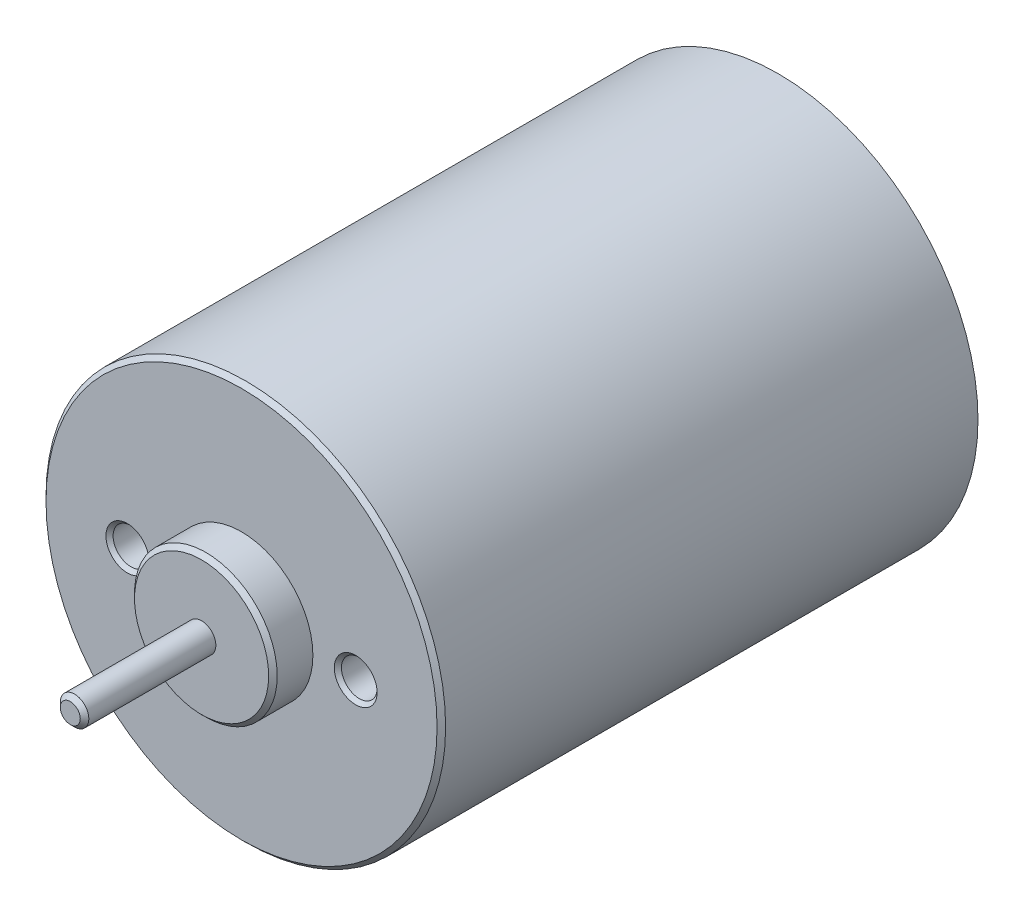
ISO-10303-21;
HEADER;
FILE_DESCRIPTION(('STEP AP214'),'2;1');
FILE_NAME('part.step','',(''),(''),'','','');
FILE_SCHEMA(('AUTOMOTIVE_DESIGN { 1 0 10303 214 1 1 1 1 }'));
ENDSEC;
DATA;
#1=APPLICATION_CONTEXT('core data for automotive mechanical design processes');
#2=APPLICATION_PROTOCOL_DEFINITION('international standard','automotive_design',2000,#1);
#3=PRODUCT_CONTEXT('',#1,'mechanical');
#4=PRODUCT('Part','Part','',(#3));
#5=PRODUCT_RELATED_PRODUCT_CATEGORY('part','',(#4));
#6=PRODUCT_DEFINITION_FORMATION('','',#4);
#7=PRODUCT_DEFINITION_CONTEXT('part definition',#1,'design');
#8=PRODUCT_DEFINITION('design','',#6,#7);
#9=PRODUCT_DEFINITION_SHAPE('','',#8);
#10=(LENGTH_UNIT() NAMED_UNIT(*) SI_UNIT(.MILLI.,.METRE.));
#11=(NAMED_UNIT(*) PLANE_ANGLE_UNIT() SI_UNIT($,.RADIAN.));
#12=(NAMED_UNIT(*) SI_UNIT($,.STERADIAN.) SOLID_ANGLE_UNIT());
#13=UNCERTAINTY_MEASURE_WITH_UNIT(LENGTH_MEASURE(1.E-05),#10,'distance_accuracy_value','');
#14=(GEOMETRIC_REPRESENTATION_CONTEXT(3) GLOBAL_UNCERTAINTY_ASSIGNED_CONTEXT((#13)) GLOBAL_UNIT_ASSIGNED_CONTEXT((#10,
#11,#12)) REPRESENTATION_CONTEXT('',''));
#15=CARTESIAN_POINT('',(0.,0.,0.));
#16=DIRECTION('',(0.,0.,1.));
#17=DIRECTION('',(1.,0.,0.));
#18=AXIS2_PLACEMENT_3D('',#15,#16,#17);
#19=CARTESIAN_POINT('',(0.,0.,37.6));
#20=DIRECTION('',(0.,0.,-1.));
#21=DIRECTION('',(-1.,0.,0.));
#22=AXIS2_PLACEMENT_3D('',#19,#20,#21);
#23=CYLINDRICAL_SURFACE('',#22,14.);
#24=CARTESIAN_POINT('',(0.,0.,37.3));
#25=DIRECTION('',(0.,0.,1.));
#26=DIRECTION('',(1.,0.,0.));
#27=AXIS2_PLACEMENT_3D('',#24,#25,#26);
#28=CIRCLE('',#27,14.);
#29=CARTESIAN_POINT('',(14.,0.,37.3));
#30=VERTEX_POINT('',#29);
#31=EDGE_CURVE('E63',#30,#30,#28,.F.);
#32=ORIENTED_EDGE('',*,*,#31,.T.);
#33=EDGE_LOOP('',(#32));
#34=FACE_BOUND('',#33,.T.);
#35=CARTESIAN_POINT('',(0.,0.,0.));
#36=DIRECTION('',(0.,0.,1.));
#37=DIRECTION('',(1.,0.,0.));
#38=AXIS2_PLACEMENT_3D('',#35,#36,#37);
#39=CIRCLE('',#38,14.);
#40=CARTESIAN_POINT('',(14.,0.,0.));
#41=VERTEX_POINT('',#40);
#42=EDGE_CURVE('E82',#41,#41,#39,.T.);
#43=ORIENTED_EDGE('',*,*,#42,.T.);
#44=EDGE_LOOP('',(#43));
#45=FACE_BOUND('',#44,.T.);
#46=ADVANCED_FACE('F31',(#34,#45),#23,.T.);
#47=CARTESIAN_POINT('',(0.,0.,37.6));
#48=DIRECTION('',(0.,0.,1.));
#49=DIRECTION('',(1.,0.,0.));
#50=AXIS2_PLACEMENT_3D('',#47,#48,#49);
#51=PLANE('',#50);
#52=CARTESIAN_POINT('',(8.,0.,37.6));
#53=DIRECTION('',(0.,0.,1.));
#54=DIRECTION('',(1.,0.,0.));
#55=AXIS2_PLACEMENT_3D('',#52,#53,#54);
#56=CIRCLE('',#55,1.50000000000003);
#57=CARTESIAN_POINT('',(9.50000000000003,0.,37.6));
#58=VERTEX_POINT('',#57);
#59=EDGE_CURVE('E38',#58,#58,#56,.F.);
#60=ORIENTED_EDGE('',*,*,#59,.T.);
#61=EDGE_LOOP('',(#60));
#62=FACE_BOUND('',#61,.T.);
#63=CARTESIAN_POINT('',(-8.,0.,37.6));
#64=DIRECTION('',(0.,0.,1.));
#65=DIRECTION('',(1.,0.,0.));
#66=AXIS2_PLACEMENT_3D('',#63,#64,#65);
#67=CIRCLE('',#66,1.50000000000003);
#68=CARTESIAN_POINT('',(-6.49999999999997,0.,37.6));
#69=VERTEX_POINT('',#68);
#70=EDGE_CURVE('E42',#69,#69,#67,.F.);
#71=ORIENTED_EDGE('',*,*,#70,.T.);
#72=EDGE_LOOP('',(#71));
#73=FACE_BOUND('',#72,.T.);
#74=CARTESIAN_POINT('',(0.,0.,37.6));
#75=DIRECTION('',(0.,0.,1.));
#76=DIRECTION('',(1.,0.,0.));
#77=AXIS2_PLACEMENT_3D('',#74,#75,#76);
#78=CIRCLE('',#77,13.7);
#79=CARTESIAN_POINT('',(13.7,0.,37.6));
#80=VERTEX_POINT('',#79);
#81=EDGE_CURVE('E66',#80,#80,#78,.T.);
#82=ORIENTED_EDGE('',*,*,#81,.T.);
#83=EDGE_LOOP('',(#82));
#84=FACE_BOUND('',#83,.T.);
#85=CARTESIAN_POINT('',(0.,0.,37.6));
#86=DIRECTION('',(0.,0.,1.));
#87=DIRECTION('',(1.,0.,0.));
#88=AXIS2_PLACEMENT_3D('',#85,#86,#87);
#89=CIRCLE('',#88,5.);
#90=CARTESIAN_POINT('',(5.,0.,37.6));
#91=VERTEX_POINT('',#90);
#92=EDGE_CURVE('E85',#91,#91,#89,.T.);
#93=ORIENTED_EDGE('',*,*,#92,.F.);
#94=EDGE_LOOP('',(#93));
#95=FACE_BOUND('',#94,.T.);
#96=ADVANCED_FACE('F119',(#62,#73,#84,#95),#51,.T.);
#97=CARTESIAN_POINT('',(0.,0.,0.));
#98=DIRECTION('',(0.,0.,1.));
#99=DIRECTION('',(1.,0.,0.));
#100=AXIS2_PLACEMENT_3D('',#97,#98,#99);
#101=PLANE('',#100);
#102=CARTESIAN_POINT('',(0.,0.,0.));
#103=DIRECTION('',(0.,0.,-1.));
#104=DIRECTION('',(-1.,0.,0.));
#105=AXIS2_PLACEMENT_3D('',#102,#103,#104);
#106=CIRCLE('',#105,5.);
#107=CARTESIAN_POINT('',(-5.,0.,0.));
#108=VERTEX_POINT('',#107);
#109=EDGE_CURVE('E92',#108,#108,#106,.T.);
#110=ORIENTED_EDGE('',*,*,#109,.F.);
#111=EDGE_LOOP('',(#110));
#112=FACE_BOUND('',#111,.T.);
#113=ORIENTED_EDGE('',*,*,#42,.F.);
#114=EDGE_LOOP('',(#113));
#115=FACE_BOUND('',#114,.T.);
#116=ADVANCED_FACE('F125',(#112,#115),#101,.F.);
#117=CARTESIAN_POINT('',(0.,0.,40.4));
#118=DIRECTION('',(0.,0.,-1.));
#119=DIRECTION('',(-1.,0.,0.));
#120=AXIS2_PLACEMENT_3D('',#117,#118,#119);
#121=CYLINDRICAL_SURFACE('',#120,5.);
#122=CARTESIAN_POINT('',(0.,0.,40.1));
#123=DIRECTION('',(0.,0.,1.));
#124=DIRECTION('',(1.,0.,0.));
#125=AXIS2_PLACEMENT_3D('',#122,#123,#124);
#126=CIRCLE('',#125,5.);
#127=CARTESIAN_POINT('',(5.,0.,40.1));
#128=VERTEX_POINT('',#127);
#129=EDGE_CURVE('E69',#128,#128,#126,.F.);
#130=ORIENTED_EDGE('',*,*,#129,.T.);
#131=EDGE_LOOP('',(#130));
#132=FACE_BOUND('',#131,.T.);
#133=ORIENTED_EDGE('',*,*,#92,.T.);
#134=EDGE_LOOP('',(#133));
#135=FACE_BOUND('',#134,.T.);
#136=ADVANCED_FACE('F192',(#132,#135),#121,.T.);
#137=CARTESIAN_POINT('',(0.,0.,40.4));
#138=DIRECTION('',(0.,0.,1.));
#139=DIRECTION('',(1.,0.,0.));
#140=AXIS2_PLACEMENT_3D('',#137,#138,#139);
#141=PLANE('',#140);
#142=CARTESIAN_POINT('',(0.,0.,40.4));
#143=DIRECTION('',(0.,0.,1.));
#144=DIRECTION('',(1.,0.,0.));
#145=AXIS2_PLACEMENT_3D('',#142,#143,#144);
#146=CIRCLE('',#145,4.7);
#147=CARTESIAN_POINT('',(4.7,0.,40.4));
#148=VERTEX_POINT('',#147);
#149=EDGE_CURVE('E72',#148,#148,#146,.T.);
#150=ORIENTED_EDGE('',*,*,#149,.T.);
#151=EDGE_LOOP('',(#150));
#152=FACE_BOUND('',#151,.T.);
#153=CARTESIAN_POINT('',(0.,0.,40.4));
#154=DIRECTION('',(0.,0.,1.));
#155=DIRECTION('',(1.,0.,0.));
#156=AXIS2_PLACEMENT_3D('',#153,#154,#155);
#157=CIRCLE('',#156,1.);
#158=CARTESIAN_POINT('',(1.,0.,40.4));
#159=VERTEX_POINT('',#158);
#160=EDGE_CURVE('E89',#159,#159,#157,.T.);
#161=ORIENTED_EDGE('',*,*,#160,.F.);
#162=EDGE_LOOP('',(#161));
#163=FACE_BOUND('',#162,.T.);
#164=ADVANCED_FACE('F188',(#152,#163),#141,.T.);
#165=CARTESIAN_POINT('',(0.,0.,49.6));
#166=DIRECTION('',(0.,0.,-1.));
#167=DIRECTION('',(-1.,0.,0.));
#168=AXIS2_PLACEMENT_3D('',#165,#166,#167);
#169=CYLINDRICAL_SURFACE('',#168,1.);
#170=CARTESIAN_POINT('',(0.,0.,49.3));
#171=DIRECTION('',(0.,0.,1.));
#172=DIRECTION('',(1.,0.,0.));
#173=AXIS2_PLACEMENT_3D('',#170,#171,#172);
#174=CIRCLE('',#173,1.);
#175=CARTESIAN_POINT('',(1.,0.,49.3));
#176=VERTEX_POINT('',#175);
#177=EDGE_CURVE('E51',#176,#176,#174,.F.);
#178=ORIENTED_EDGE('',*,*,#177,.T.);
#179=EDGE_LOOP('',(#178));
#180=FACE_BOUND('',#179,.T.);
#181=ORIENTED_EDGE('',*,*,#160,.T.);
#182=EDGE_LOOP('',(#181));
#183=FACE_BOUND('',#182,.T.);
#184=ADVANCED_FACE('F184',(#180,#183),#169,.T.);
#185=CARTESIAN_POINT('',(0.,0.,49.6));
#186=DIRECTION('',(0.,0.,1.));
#187=DIRECTION('',(1.,0.,0.));
#188=AXIS2_PLACEMENT_3D('',#185,#186,#187);
#189=PLANE('',#188);
#190=CARTESIAN_POINT('',(0.,0.,49.6));
#191=DIRECTION('',(0.,0.,1.));
#192=DIRECTION('',(1.,0.,0.));
#193=AXIS2_PLACEMENT_3D('',#190,#191,#192);
#194=CIRCLE('',#193,0.699999999999999);
#195=CARTESIAN_POINT('',(0.699999999999999,0.,49.6));
#196=VERTEX_POINT('',#195);
#197=EDGE_CURVE('E54',#196,#196,#194,.T.);
#198=ORIENTED_EDGE('',*,*,#197,.T.);
#199=EDGE_LOOP('',(#198));
#200=FACE_BOUND('',#199,.T.);
#201=ADVANCED_FACE('F180',(#200),#189,.T.);
#202=CARTESIAN_POINT('',(0.,0.,-2.6));
#203=DIRECTION('',(0.,0.,1.));
#204=DIRECTION('',(1.,0.,0.));
#205=AXIS2_PLACEMENT_3D('',#202,#203,#204);
#206=CYLINDRICAL_SURFACE('',#205,5.);
#207=CARTESIAN_POINT('',(0.,0.,-2.3));
#208=DIRECTION('',(0.,0.,-1.));
#209=DIRECTION('',(-1.,0.,0.));
#210=AXIS2_PLACEMENT_3D('',#207,#208,#209);
#211=CIRCLE('',#210,5.);
#212=CARTESIAN_POINT('',(5.,0.,-2.3));
#213=VERTEX_POINT('',#212);
#214=EDGE_CURVE('E75',#213,#213,#211,.F.);
#215=ORIENTED_EDGE('',*,*,#214,.T.);
#216=EDGE_LOOP('',(#215));
#217=FACE_BOUND('',#216,.T.);
#218=ORIENTED_EDGE('',*,*,#109,.T.);
#219=EDGE_LOOP('',(#218));
#220=FACE_BOUND('',#219,.T.);
#221=ADVANCED_FACE('F176',(#217,#220),#206,.T.);
#222=CARTESIAN_POINT('',(0.,0.,-2.6));
#223=DIRECTION('',(0.,0.,-1.));
#224=DIRECTION('',(-1.,0.,0.));
#225=AXIS2_PLACEMENT_3D('',#222,#223,#224);
#226=PLANE('',#225);
#227=CARTESIAN_POINT('',(0.,0.,-2.6));
#228=DIRECTION('',(0.,0.,-1.));
#229=DIRECTION('',(-1.,0.,0.));
#230=AXIS2_PLACEMENT_3D('',#227,#228,#229);
#231=CIRCLE('',#230,4.7);
#232=CARTESIAN_POINT('',(4.7,0.,-2.6));
#233=VERTEX_POINT('',#232);
#234=EDGE_CURVE('E78',#233,#233,#231,.T.);
#235=ORIENTED_EDGE('',*,*,#234,.T.);
#236=EDGE_LOOP('',(#235));
#237=FACE_BOUND('',#236,.T.);
#238=CARTESIAN_POINT('',(0.,0.,-2.6));
#239=DIRECTION('',(0.,0.,-1.));
#240=DIRECTION('',(-1.,0.,0.));
#241=AXIS2_PLACEMENT_3D('',#238,#239,#240);
#242=CIRCLE('',#241,1.);
#243=CARTESIAN_POINT('',(-1.,0.,-2.6));
#244=VERTEX_POINT('',#243);
#245=EDGE_CURVE('E81',#244,#244,#242,.T.);
#246=ORIENTED_EDGE('',*,*,#245,.F.);
#247=EDGE_LOOP('',(#246));
#248=FACE_BOUND('',#247,.T.);
#249=ADVANCED_FACE('F172',(#237,#248),#226,.T.);
#250=CARTESIAN_POINT('',(0.,0.,-4.));
#251=DIRECTION('',(0.,0.,1.));
#252=DIRECTION('',(1.,0.,0.));
#253=AXIS2_PLACEMENT_3D('',#250,#251,#252);
#254=CYLINDRICAL_SURFACE('',#253,1.);
#255=CARTESIAN_POINT('',(0.,0.,-3.7));
#256=DIRECTION('',(0.,0.,-1.));
#257=DIRECTION('',(-1.,0.,0.));
#258=AXIS2_PLACEMENT_3D('',#255,#256,#257);
#259=CIRCLE('',#258,1.);
#260=CARTESIAN_POINT('',(-1.,0.,-3.7));
#261=VERTEX_POINT('',#260);
#262=EDGE_CURVE('E57',#261,#261,#259,.F.);
#263=ORIENTED_EDGE('',*,*,#262,.T.);
#264=EDGE_LOOP('',(#263));
#265=FACE_BOUND('',#264,.T.);
#266=ORIENTED_EDGE('',*,*,#245,.T.);
#267=EDGE_LOOP('',(#266));
#268=FACE_BOUND('',#267,.T.);
#269=ADVANCED_FACE('F168',(#265,#268),#254,.T.);
#270=CARTESIAN_POINT('',(0.,0.,-4.));
#271=DIRECTION('',(0.,0.,-1.));
#272=DIRECTION('',(-1.,0.,0.));
#273=AXIS2_PLACEMENT_3D('',#270,#271,#272);
#274=PLANE('',#273);
#275=CARTESIAN_POINT('',(0.,0.,-4.));
#276=DIRECTION('',(0.,0.,-1.));
#277=DIRECTION('',(-1.,0.,0.));
#278=AXIS2_PLACEMENT_3D('',#275,#276,#277);
#279=CIRCLE('',#278,0.699999999999999);
#280=CARTESIAN_POINT('',(-0.699999999999999,0.,-4.));
#281=VERTEX_POINT('',#280);
#282=EDGE_CURVE('E60',#281,#281,#279,.T.);
#283=ORIENTED_EDGE('',*,*,#282,.T.);
#284=EDGE_LOOP('',(#283));
#285=FACE_BOUND('',#284,.T.);
#286=ADVANCED_FACE('F134',(#285),#274,.T.);
#287=CARTESIAN_POINT('',(0.,0.,-2.6));
#288=DIRECTION('',(0.,0.,1.));
#289=DIRECTION('',(1.,0.,0.));
#290=AXIS2_PLACEMENT_3D('',#287,#288,#289);
#291=CONICAL_SURFACE('',#290,4.7,0.785398163397454);
#292=CARTESIAN_POINT('',(5.,0.,-2.3));
#293=CARTESIAN_POINT('',(4.996875,0.,-2.303125));
#294=CARTESIAN_POINT('',(4.99375,0.,-2.30625));
#295=CARTESIAN_POINT('',(4.9875,0.,-2.3125));
#296=CARTESIAN_POINT('',(4.984375,0.,-2.315625));
#297=CARTESIAN_POINT('',(4.978125,0.,-2.321875));
#298=CARTESIAN_POINT('',(4.975,0.,-2.325));
#299=CARTESIAN_POINT('',(4.96875,0.,-2.33125));
#300=CARTESIAN_POINT('',(4.965625,0.,-2.334375));
#301=CARTESIAN_POINT('',(4.959375,0.,-2.340625));
#302=CARTESIAN_POINT('',(4.95625,0.,-2.34375));
#303=CARTESIAN_POINT('',(4.95,0.,-2.35));
#304=CARTESIAN_POINT('',(4.946875,0.,-2.353125));
#305=CARTESIAN_POINT('',(4.940625,0.,-2.359375));
#306=CARTESIAN_POINT('',(4.9375,0.,-2.3625));
#307=CARTESIAN_POINT('',(4.93125,0.,-2.36875));
#308=CARTESIAN_POINT('',(4.928125,0.,-2.371875));
#309=CARTESIAN_POINT('',(4.921875,0.,-2.378125));
#310=CARTESIAN_POINT('',(4.91875,0.,-2.38125));
#311=CARTESIAN_POINT('',(4.9125,0.,-2.3875));
#312=CARTESIAN_POINT('',(4.909375,0.,-2.390625));
#313=CARTESIAN_POINT('',(4.903125,0.,-2.396875));
#314=CARTESIAN_POINT('',(4.9,0.,-2.4));
#315=CARTESIAN_POINT('',(4.89375,0.,-2.40625));
#316=CARTESIAN_POINT('',(4.890625,0.,-2.409375));
#317=CARTESIAN_POINT('',(4.884375,0.,-2.415625));
#318=CARTESIAN_POINT('',(4.88125,0.,-2.41875));
#319=CARTESIAN_POINT('',(4.875,0.,-2.425));
#320=CARTESIAN_POINT('',(4.871875,0.,-2.428125));
#321=CARTESIAN_POINT('',(4.865625,0.,-2.434375));
#322=CARTESIAN_POINT('',(4.8625,0.,-2.4375));
#323=CARTESIAN_POINT('',(4.85625,0.,-2.44375));
#324=CARTESIAN_POINT('',(4.853125,0.,-2.446875));
#325=CARTESIAN_POINT('',(4.846875,0.,-2.453125));
#326=CARTESIAN_POINT('',(4.84375,0.,-2.45625));
#327=CARTESIAN_POINT('',(4.8375,0.,-2.4625));
#328=CARTESIAN_POINT('',(4.834375,0.,-2.465625));
#329=CARTESIAN_POINT('',(4.828125,0.,-2.471875));
#330=CARTESIAN_POINT('',(4.825,0.,-2.475));
#331=CARTESIAN_POINT('',(4.81875,0.,-2.48125));
#332=CARTESIAN_POINT('',(4.815625,0.,-2.484375));
#333=CARTESIAN_POINT('',(4.809375,0.,-2.490625));
#334=CARTESIAN_POINT('',(4.80625,0.,-2.49375));
#335=CARTESIAN_POINT('',(4.8,0.,-2.5));
#336=CARTESIAN_POINT('',(4.796875,0.,-2.503125));
#337=CARTESIAN_POINT('',(4.790625,0.,-2.509375));
#338=CARTESIAN_POINT('',(4.7875,0.,-2.5125));
#339=CARTESIAN_POINT('',(4.78125,0.,-2.51875));
#340=CARTESIAN_POINT('',(4.778125,0.,-2.521875));
#341=CARTESIAN_POINT('',(4.771875,0.,-2.528125));
#342=CARTESIAN_POINT('',(4.76875,0.,-2.53125));
#343=CARTESIAN_POINT('',(4.7625,0.,-2.5375));
#344=CARTESIAN_POINT('',(4.759375,0.,-2.540625));
#345=CARTESIAN_POINT('',(4.753125,0.,-2.546875));
#346=CARTESIAN_POINT('',(4.75,0.,-2.55));
#347=CARTESIAN_POINT('',(4.74375,0.,-2.55625));
#348=CARTESIAN_POINT('',(4.740625,0.,-2.559375));
#349=CARTESIAN_POINT('',(4.734375,0.,-2.565625));
#350=CARTESIAN_POINT('',(4.73125,0.,-2.56875));
#351=CARTESIAN_POINT('',(4.725,0.,-2.575));
#352=CARTESIAN_POINT('',(4.721875,0.,-2.578125));
#353=CARTESIAN_POINT('',(4.715625,0.,-2.584375));
#354=CARTESIAN_POINT('',(4.7125,0.,-2.5875));
#355=CARTESIAN_POINT('',(4.70625,0.,-2.59375));
#356=CARTESIAN_POINT('',(4.703125,0.,-2.596875));
#357=CARTESIAN_POINT('',(4.7,0.,-2.6));
#358=B_SPLINE_CURVE_WITH_KNOTS('',3,(#292,#293,#294,#295,#296,#297,#298,#299,#300,#301,#302,
#303,#304,#305,#306,#307,#308,#309,#310,#311,#312,#313,#314,#315,#316,#317,#318,#319,#320,#321,
#322,#323,#324,#325,#326,#327,#328,#329,#330,#331,#332,#333,#334,#335,#336,#337,#338,#339,#340,
#341,#342,#343,#344,#345,#346,#347,#348,#349,#350,#351,#352,#353,#354,#355,#356,#357),
.UNSPECIFIED.,.F.,.F.,(4,2,2,2,2,2,2,2,2,2,2,2,2,2,2,2,2,2,2,2,2,2,2,2,2,2,2,2,2,2,2,2,4),(0.,
0.0132582521472478,0.0265165042944954,0.0397747564417438,0.0530330085889914,0.0662912607362392,
0.0795495128834873,0.0928077650307349,0.106066017177983,0.119324269325231,0.132582521472479,
0.145840773619726,0.159099025766975,0.172357277914222,0.185615530061471,0.198873782208718,
0.212132034355966,0.225390286503214,0.238648538650462,0.25190679079771,0.265165042944958,
0.278423295092206,0.291681547239453,0.304939799386702,0.318198051533949,0.331456303681197,
0.344714555828445,0.357972807975693,0.37123106012294,0.384489312270189,0.397747564417436,
0.411005816564684,0.424264068711932),.UNSPECIFIED.);
#359=EDGE_CURVE('BSEAM130',#213,#233,#358,.T.);
#360=ORIENTED_EDGE('',*,*,#214,.F.);
#361=ORIENTED_EDGE('',*,*,#234,.F.);
#362=ORIENTED_EDGE('',*,*,#359,.T.);
#363=ORIENTED_EDGE('',*,*,#359,.F.);
#364=EDGE_LOOP('',(#360,#362,#361,#363));
#365=FACE_BOUND('',#364,.T.);
#366=ADVANCED_FACE('F130',(#365),#291,.T.);
#367=CARTESIAN_POINT('',(0.,0.,40.4));
#368=DIRECTION('',(0.,0.,-1.));
#369=DIRECTION('',(-1.,0.,0.));
#370=AXIS2_PLACEMENT_3D('',#367,#368,#369);
#371=CONICAL_SURFACE('',#370,4.7,0.785398163397453);
#372=ORIENTED_EDGE('',*,*,#129,.F.);
#373=EDGE_LOOP('',(#372));
#374=FACE_BOUND('',#373,.T.);
#375=ORIENTED_EDGE('',*,*,#149,.F.);
#376=EDGE_LOOP('',(#375));
#377=FACE_BOUND('',#376,.T.);
#378=ADVANCED_FACE('F133',(#374,#377),#371,.T.);
#379=CARTESIAN_POINT('',(0.,0.,37.6));
#380=DIRECTION('',(0.,0.,-1.));
#381=DIRECTION('',(-1.,0.,0.));
#382=AXIS2_PLACEMENT_3D('',#379,#380,#381);
#383=CONICAL_SURFACE('',#382,13.7,0.785398163397451);
#384=ORIENTED_EDGE('',*,*,#31,.F.);
#385=EDGE_LOOP('',(#384));
#386=FACE_BOUND('',#385,.T.);
#387=ORIENTED_EDGE('',*,*,#81,.F.);
#388=EDGE_LOOP('',(#387));
#389=FACE_BOUND('',#388,.T.);
#390=ADVANCED_FACE('F138',(#386,#389),#383,.T.);
#391=CARTESIAN_POINT('',(0.,0.,-4.));
#392=DIRECTION('',(0.,0.,1.));
#393=DIRECTION('',(1.,0.,0.));
#394=AXIS2_PLACEMENT_3D('',#391,#392,#393);
#395=CONICAL_SURFACE('',#394,0.699999999999999,0.785398163397454);
#396=ORIENTED_EDGE('',*,*,#262,.F.);
#397=EDGE_LOOP('',(#396));
#398=FACE_BOUND('',#397,.T.);
#399=ORIENTED_EDGE('',*,*,#282,.F.);
#400=EDGE_LOOP('',(#399));
#401=FACE_BOUND('',#400,.T.);
#402=ADVANCED_FACE('F142',(#398,#401),#395,.T.);
#403=CARTESIAN_POINT('',(0.,0.,49.6));
#404=DIRECTION('',(0.,0.,-1.));
#405=DIRECTION('',(-1.,0.,0.));
#406=AXIS2_PLACEMENT_3D('',#403,#404,#405);
#407=CONICAL_SURFACE('',#406,0.699999999999999,0.785398163397458);
#408=ORIENTED_EDGE('',*,*,#177,.F.);
#409=EDGE_LOOP('',(#408));
#410=FACE_BOUND('',#409,.T.);
#411=ORIENTED_EDGE('',*,*,#197,.F.);
#412=EDGE_LOOP('',(#411));
#413=FACE_BOUND('',#412,.T.);
#414=ADVANCED_FACE('F146',(#410,#413),#407,.T.);
#415=CARTESIAN_POINT('',(8.,0.,35.1));
#416=DIRECTION('',(0.,0.,1.));
#417=DIRECTION('',(1.,0.,0.));
#418=AXIS2_PLACEMENT_3D('',#415,#416,#417);
#419=CYLINDRICAL_SURFACE('',#418,1.25);
#420=CARTESIAN_POINT('',(8.,0.,37.35));
#421=DIRECTION('',(0.,0.,1.));
#422=DIRECTION('',(1.,0.,0.));
#423=AXIS2_PLACEMENT_3D('',#420,#421,#422);
#424=CIRCLE('',#423,1.25);
#425=CARTESIAN_POINT('',(9.25,0.,37.35));
#426=VERTEX_POINT('',#425);
#427=EDGE_CURVE('E46',#426,#426,#424,.T.);
#428=ORIENTED_EDGE('',*,*,#427,.T.);
#429=EDGE_LOOP('',(#428));
#430=FACE_BOUND('',#429,.T.);
#431=CARTESIAN_POINT('',(8.,0.,35.1));
#432=DIRECTION('',(0.,0.,1.));
#433=DIRECTION('',(1.,0.,0.));
#434=AXIS2_PLACEMENT_3D('',#431,#432,#433);
#435=CIRCLE('',#434,1.25);
#436=CARTESIAN_POINT('',(9.25,0.,35.1));
#437=VERTEX_POINT('',#436);
#438=EDGE_CURVE('E97',#437,#437,#435,.T.);
#439=ORIENTED_EDGE('',*,*,#438,.F.);
#440=EDGE_LOOP('',(#439));
#441=FACE_BOUND('',#440,.T.);
#442=ADVANCED_FACE('F115',(#430,#441),#419,.F.);
#443=CARTESIAN_POINT('',(8.,0.,35.1));
#444=DIRECTION('',(0.,0.,1.));
#445=DIRECTION('',(1.,0.,0.));
#446=AXIS2_PLACEMENT_3D('',#443,#444,#445);
#447=PLANE('',#446);
#448=ORIENTED_EDGE('',*,*,#438,.T.);
#449=EDGE_LOOP('',(#448));
#450=FACE_BOUND('',#449,.T.);
#451=ADVANCED_FACE('F107',(#450),#447,.T.);
#452=CARTESIAN_POINT('',(-8.,0.,35.1));
#453=DIRECTION('',(0.,0.,1.));
#454=DIRECTION('',(1.,0.,0.));
#455=AXIS2_PLACEMENT_3D('',#452,#453,#454);
#456=CYLINDRICAL_SURFACE('',#455,1.25);
#457=CARTESIAN_POINT('',(-8.,0.,37.35));
#458=DIRECTION('',(0.,0.,1.));
#459=DIRECTION('',(1.,0.,0.));
#460=AXIS2_PLACEMENT_3D('',#457,#458,#459);
#461=CIRCLE('',#460,1.25);
#462=CARTESIAN_POINT('',(-6.75,0.,37.35));
#463=VERTEX_POINT('',#462);
#464=EDGE_CURVE('E10',#463,#463,#461,.T.);
#465=ORIENTED_EDGE('',*,*,#464,.T.);
#466=EDGE_LOOP('',(#465));
#467=FACE_BOUND('',#466,.T.);
#468=CARTESIAN_POINT('',(-8.,0.,35.1));
#469=DIRECTION('',(0.,0.,1.));
#470=DIRECTION('',(1.,0.,0.));
#471=AXIS2_PLACEMENT_3D('',#468,#469,#470);
#472=CIRCLE('',#471,1.25);
#473=CARTESIAN_POINT('',(-6.75,0.,35.1));
#474=VERTEX_POINT('',#473);
#475=EDGE_CURVE('E86',#474,#474,#472,.T.);
#476=ORIENTED_EDGE('',*,*,#475,.F.);
#477=EDGE_LOOP('',(#476));
#478=FACE_BOUND('',#477,.T.);
#479=ADVANCED_FACE('F105',(#467,#478),#456,.F.);
#480=CARTESIAN_POINT('',(-8.,0.,35.1));
#481=DIRECTION('',(0.,0.,1.));
#482=DIRECTION('',(1.,0.,0.));
#483=AXIS2_PLACEMENT_3D('',#480,#481,#482);
#484=PLANE('',#483);
#485=ORIENTED_EDGE('',*,*,#475,.T.);
#486=EDGE_LOOP('',(#485));
#487=FACE_BOUND('',#486,.T.);
#488=ADVANCED_FACE('F103',(#487),#484,.T.);
#489=CARTESIAN_POINT('',(8.,0.,37.35));
#490=DIRECTION('',(0.,0.,1.));
#491=DIRECTION('',(1.,0.,0.));
#492=AXIS2_PLACEMENT_3D('',#489,#490,#491);
#493=CONICAL_SURFACE('',#492,1.25,0.785398163397438);
#494=ORIENTED_EDGE('',*,*,#59,.F.);
#495=EDGE_LOOP('',(#494));
#496=FACE_BOUND('',#495,.T.);
#497=ORIENTED_EDGE('',*,*,#427,.F.);
#498=EDGE_LOOP('',(#497));
#499=FACE_BOUND('',#498,.T.);
#500=ADVANCED_FACE('F113',(#496,#499),#493,.F.);
#501=CARTESIAN_POINT('',(-8.,0.,37.35));
#502=DIRECTION('',(0.,0.,1.));
#503=DIRECTION('',(1.,0.,0.));
#504=AXIS2_PLACEMENT_3D('',#501,#502,#503);
#505=CONICAL_SURFACE('',#504,1.25,0.785398163397438);
#506=ORIENTED_EDGE('',*,*,#70,.F.);
#507=EDGE_LOOP('',(#506));
#508=FACE_BOUND('',#507,.T.);
#509=ORIENTED_EDGE('',*,*,#464,.F.);
#510=EDGE_LOOP('',(#509));
#511=FACE_BOUND('',#510,.T.);
#512=ADVANCED_FACE('F33',(#508,#511),#505,.F.);
#513=CLOSED_SHELL('',(#46,#96,#116,#136,#164,#184,#201,#221,#249,#269,#286,#366,#378,#390,#402,
#414,#442,#451,#479,#488,#500,#512));
#514=MANIFOLD_SOLID_BREP('B2',#513);
#515=ADVANCED_BREP_SHAPE_REPRESENTATION('',(#18,#514),#14);
#516=SHAPE_DEFINITION_REPRESENTATION(#9,#515);
ENDSEC;
END-ISO-10303-21;
